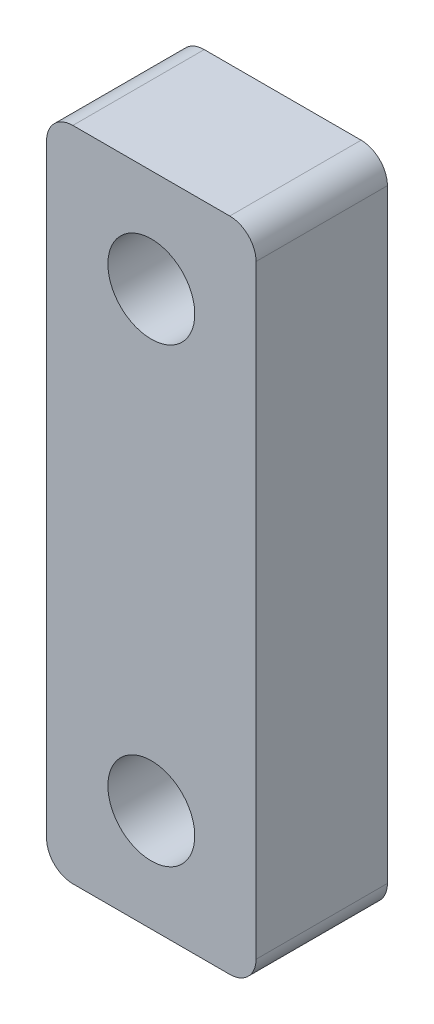
ISO-10303-21;
HEADER;
FILE_DESCRIPTION(('STEP AP214'),'2;1');
FILE_NAME('part.step','',(''),(''),'','','');
FILE_SCHEMA(('AUTOMOTIVE_DESIGN { 1 0 10303 214 1 1 1 1 }'));
ENDSEC;
DATA;
#1=APPLICATION_CONTEXT('core data for automotive mechanical design processes');
#2=APPLICATION_PROTOCOL_DEFINITION('international standard','automotive_design',2000,#1);
#3=PRODUCT_CONTEXT('',#1,'mechanical');
#4=PRODUCT('Part','Part','',(#3));
#5=PRODUCT_RELATED_PRODUCT_CATEGORY('part','',(#4));
#6=PRODUCT_DEFINITION_FORMATION('','',#4);
#7=PRODUCT_DEFINITION_CONTEXT('part definition',#1,'design');
#8=PRODUCT_DEFINITION('design','',#6,#7);
#9=PRODUCT_DEFINITION_SHAPE('','',#8);
#10=(LENGTH_UNIT() NAMED_UNIT(*) SI_UNIT(.MILLI.,.METRE.));
#11=(NAMED_UNIT(*) PLANE_ANGLE_UNIT() SI_UNIT($,.RADIAN.));
#12=(NAMED_UNIT(*) SI_UNIT($,.STERADIAN.) SOLID_ANGLE_UNIT());
#13=UNCERTAINTY_MEASURE_WITH_UNIT(LENGTH_MEASURE(1.E-05),#10,'distance_accuracy_value','');
#14=(GEOMETRIC_REPRESENTATION_CONTEXT(3) GLOBAL_UNCERTAINTY_ASSIGNED_CONTEXT((#13)) GLOBAL_UNIT_ASSIGNED_CONTEXT((#10,
#11,#12)) REPRESENTATION_CONTEXT('',''));
#15=CARTESIAN_POINT('',(0.,0.,0.));
#16=DIRECTION('',(0.,0.,1.));
#17=DIRECTION('',(1.,0.,0.));
#18=AXIS2_PLACEMENT_3D('',#15,#16,#17);
#19=CARTESIAN_POINT('',(468.012400016,1.31356913650478E-11,564.642));
#20=DIRECTION('',(1.,0.,0.));
#21=DIRECTION('',(0.,0.,-1.));
#22=AXIS2_PLACEMENT_3D('',#19,#20,#21);
#23=PLANE('',#22);
#24=DIRECTION('',(0.,1.,0.));
#25=VECTOR('',#24,1.);
#26=CARTESIAN_POINT('',(468.012400016,1.31356913650478E-11,564.642));
#27=LINE('',#26,#25);
#28=CARTESIAN_POINT('',(468.012400016,-14.6049999999869,564.642000000001));
#29=VERTEX_POINT('',#28);
#30=CARTESIAN_POINT('',(468.012400016,14.6050000000131,564.642));
#31=VERTEX_POINT('',#30);
#32=EDGE_CURVE('E129',#29,#31,#27,.T.);
#33=ORIENTED_EDGE('',*,*,#32,.F.);
#34=DIRECTION('',(0.,0.,1.));
#35=VECTOR('',#34,1.);
#36=CARTESIAN_POINT('',(468.012400016,-14.6049999999869,564.642));
#37=LINE('',#36,#35);
#38=CARTESIAN_POINT('',(468.012400016,-14.6049999999869,570.992000000001));
#39=VERTEX_POINT('',#38);
#40=EDGE_CURVE('E11',#29,#39,#37,.T.);
#41=ORIENTED_EDGE('',*,*,#40,.T.);
#42=DIRECTION('',(0.,1.,0.));
#43=VECTOR('',#42,1.);
#44=CARTESIAN_POINT('',(468.012400016,1.31356913650478E-11,570.992));
#45=LINE('',#44,#43);
#46=CARTESIAN_POINT('',(468.012400016,14.6050000000131,570.992));
#47=VERTEX_POINT('',#46);
#48=EDGE_CURVE('E131',#39,#47,#45,.T.);
#49=ORIENTED_EDGE('',*,*,#48,.T.);
#50=DIRECTION('',(0.,0.,1.));
#51=VECTOR('',#50,1.);
#52=CARTESIAN_POINT('',(468.012400016,14.6050000000131,564.642));
#53=LINE('',#52,#51);
#54=EDGE_CURVE('E42',#47,#31,#53,.F.);
#55=ORIENTED_EDGE('',*,*,#54,.T.);
#56=EDGE_LOOP('',(#33,#41,#49,#55));
#57=FACE_BOUND('',#56,.T.);
#58=ADVANCED_FACE('F34',(#57),#23,.F.);
#59=CARTESIAN_POINT('',(0.,15.8750000000131,564.642));
#60=DIRECTION('',(0.,-1.,0.));
#61=DIRECTION('',(0.,0.,-1.));
#62=AXIS2_PLACEMENT_3D('',#59,#60,#61);
#63=PLANE('',#62);
#64=DIRECTION('',(1.,0.,0.));
#65=VECTOR('',#64,1.);
#66=CARTESIAN_POINT('',(0.,15.8750000000131,570.992));
#67=LINE('',#66,#65);
#68=CARTESIAN_POINT('',(469.282400016,15.8750000000131,570.992));
#69=VERTEX_POINT('',#68);
#70=CARTESIAN_POINT('',(476.867599984,15.8750000000131,570.992));
#71=VERTEX_POINT('',#70);
#72=EDGE_CURVE('E127',#69,#71,#67,.T.);
#73=ORIENTED_EDGE('',*,*,#72,.T.);
#74=DIRECTION('',(0.,0.,1.));
#75=VECTOR('',#74,1.);
#76=CARTESIAN_POINT('',(476.867599984,15.8750000000131,564.642));
#77=LINE('',#76,#75);
#78=CARTESIAN_POINT('',(476.867599984,15.8750000000131,564.642));
#79=VERTEX_POINT('',#78);
#80=EDGE_CURVE('E106',#71,#79,#77,.F.);
#81=ORIENTED_EDGE('',*,*,#80,.T.);
#82=DIRECTION('',(1.,0.,0.));
#83=VECTOR('',#82,1.);
#84=CARTESIAN_POINT('',(0.,15.8750000000131,564.642));
#85=LINE('',#84,#83);
#86=CARTESIAN_POINT('',(469.282400016,15.8750000000131,564.642));
#87=VERTEX_POINT('',#86);
#88=EDGE_CURVE('E167',#87,#79,#85,.T.);
#89=ORIENTED_EDGE('',*,*,#88,.F.);
#90=DIRECTION('',(0.,0.,1.));
#91=VECTOR('',#90,1.);
#92=CARTESIAN_POINT('',(469.282400016,15.8750000000131,564.642));
#93=LINE('',#92,#91);
#94=EDGE_CURVE('E111',#87,#69,#93,.T.);
#95=ORIENTED_EDGE('',*,*,#94,.T.);
#96=EDGE_LOOP('',(#73,#81,#89,#95));
#97=FACE_BOUND('',#96,.T.);
#98=ADVANCED_FACE('F171',(#97),#63,.F.);
#99=CARTESIAN_POINT('',(478.137599984,1.31356913650478E-11,564.642));
#100=DIRECTION('',(-1.,0.,0.));
#101=DIRECTION('',(0.,0.,1.));
#102=AXIS2_PLACEMENT_3D('',#99,#100,#101);
#103=PLANE('',#102);
#104=DIRECTION('',(0.,-1.,0.));
#105=VECTOR('',#104,1.);
#106=CARTESIAN_POINT('',(478.137599984,1.31356913650478E-11,564.642));
#107=LINE('',#106,#105);
#108=CARTESIAN_POINT('',(478.137599984,14.6050000000131,564.642));
#109=VERTEX_POINT('',#108);
#110=CARTESIAN_POINT('',(478.137599984,-14.6049999999869,564.642000000001));
#111=VERTEX_POINT('',#110);
#112=EDGE_CURVE('E120',#109,#111,#107,.T.);
#113=ORIENTED_EDGE('',*,*,#112,.F.);
#114=DIRECTION('',(0.,0.,1.));
#115=VECTOR('',#114,1.);
#116=CARTESIAN_POINT('',(478.137599984,14.6050000000131,564.642));
#117=LINE('',#116,#115);
#118=CARTESIAN_POINT('',(478.137599984,14.6050000000131,570.992));
#119=VERTEX_POINT('',#118);
#120=EDGE_CURVE('E105',#109,#119,#117,.T.);
#121=ORIENTED_EDGE('',*,*,#120,.T.);
#122=DIRECTION('',(0.,-1.,0.));
#123=VECTOR('',#122,1.);
#124=CARTESIAN_POINT('',(478.137599984,1.31356913650478E-11,570.992));
#125=LINE('',#124,#123);
#126=CARTESIAN_POINT('',(478.137599984,-14.6049999999869,570.992000000001));
#127=VERTEX_POINT('',#126);
#128=EDGE_CURVE('E118',#119,#127,#125,.T.);
#129=ORIENTED_EDGE('',*,*,#128,.T.);
#130=DIRECTION('',(0.,0.,1.));
#131=VECTOR('',#130,1.);
#132=CARTESIAN_POINT('',(478.137599984,-14.6049999999869,564.642));
#133=LINE('',#132,#131);
#134=EDGE_CURVE('E122',#127,#111,#133,.F.);
#135=ORIENTED_EDGE('',*,*,#134,.T.);
#136=EDGE_LOOP('',(#113,#121,#129,#135));
#137=FACE_BOUND('',#136,.T.);
#138=ADVANCED_FACE('F117',(#137),#103,.F.);
#139=CARTESIAN_POINT('',(0.,-15.8749999999869,564.642000000001));
#140=DIRECTION('',(0.,1.,0.));
#141=DIRECTION('',(0.,0.,1.));
#142=AXIS2_PLACEMENT_3D('',#139,#140,#141);
#143=PLANE('',#142);
#144=DIRECTION('',(-1.,0.,0.));
#145=VECTOR('',#144,1.);
#146=CARTESIAN_POINT('',(0.,-15.8749999999869,564.642000000001));
#147=LINE('',#146,#145);
#148=CARTESIAN_POINT('',(476.867599984,-15.8749999999869,564.642000000001));
#149=VERTEX_POINT('',#148);
#150=CARTESIAN_POINT('',(469.282400016,-15.8749999999869,564.642000000001));
#151=VERTEX_POINT('',#150);
#152=EDGE_CURVE('E135',#149,#151,#147,.T.);
#153=ORIENTED_EDGE('',*,*,#152,.F.);
#154=DIRECTION('',(0.,0.,1.));
#155=VECTOR('',#154,1.);
#156=CARTESIAN_POINT('',(476.867599984,-15.8749999999869,564.642000000001));
#157=LINE('',#156,#155);
#158=CARTESIAN_POINT('',(476.867599984,-15.8749999999869,570.992000000001));
#159=VERTEX_POINT('',#158);
#160=EDGE_CURVE('E152',#149,#159,#157,.T.);
#161=ORIENTED_EDGE('',*,*,#160,.T.);
#162=DIRECTION('',(-1.,0.,0.));
#163=VECTOR('',#162,1.);
#164=CARTESIAN_POINT('',(0.,-15.8749999999869,570.992000000001));
#165=LINE('',#164,#163);
#166=CARTESIAN_POINT('',(469.282400016,-15.8749999999869,570.992000000001));
#167=VERTEX_POINT('',#166);
#168=EDGE_CURVE('E126',#159,#167,#165,.T.);
#169=ORIENTED_EDGE('',*,*,#168,.T.);
#170=DIRECTION('',(0.,0.,1.));
#171=VECTOR('',#170,1.);
#172=CARTESIAN_POINT('',(469.282400016,-15.8749999999869,564.642000000001));
#173=LINE('',#172,#171);
#174=EDGE_CURVE('E49',#167,#151,#173,.F.);
#175=ORIENTED_EDGE('',*,*,#174,.T.);
#176=EDGE_LOOP('',(#153,#161,#169,#175));
#177=FACE_BOUND('',#176,.T.);
#178=ADVANCED_FACE('F275',(#177),#143,.F.);
#179=CARTESIAN_POINT('',(0.,1.31356913650477E-11,564.642));
#180=DIRECTION('',(0.,0.,-1.));
#181=DIRECTION('',(0.,1.,0.));
#182=AXIS2_PLACEMENT_3D('',#179,#180,#181);
#183=PLANE('',#182);
#184=CARTESIAN_POINT('',(473.075,10.9220000000131,564.642));
#185=DIRECTION('',(0.,0.,1.));
#186=DIRECTION('',(0.,-1.,0.));
#187=AXIS2_PLACEMENT_3D('',#184,#185,#186);
#188=CIRCLE('',#187,2.09999999999999);
#189=CARTESIAN_POINT('',(473.075,8.82200000001315,564.642));
#190=VERTEX_POINT('',#189);
#191=EDGE_CURVE('E181',#190,#190,#188,.T.);
#192=ORIENTED_EDGE('',*,*,#191,.T.);
#193=EDGE_LOOP('',(#192));
#194=FACE_BOUND('',#193,.T.);
#195=CARTESIAN_POINT('',(473.075,-10.9219999999869,564.642000000001));
#196=DIRECTION('',(0.,0.,1.));
#197=DIRECTION('',(0.,-1.,0.));
#198=AXIS2_PLACEMENT_3D('',#195,#196,#197);
#199=CIRCLE('',#198,2.09999999999999);
#200=CARTESIAN_POINT('',(473.075,-13.0219999999869,564.642000000001));
#201=VERTEX_POINT('',#200);
#202=EDGE_CURVE('E172',#201,#201,#199,.T.);
#203=ORIENTED_EDGE('',*,*,#202,.T.);
#204=EDGE_LOOP('',(#203));
#205=FACE_BOUND('',#204,.T.);
#206=ORIENTED_EDGE('',*,*,#88,.T.);
#207=CARTESIAN_POINT('',(476.867599984,14.6050000000131,564.642));
#208=DIRECTION('',(0.,0.,-1.));
#209=DIRECTION('',(0.,1.,0.));
#210=AXIS2_PLACEMENT_3D('',#207,#208,#209);
#211=CIRCLE('',#210,1.27);
#212=EDGE_CURVE('E149',#79,#109,#211,.T.);
#213=ORIENTED_EDGE('',*,*,#212,.T.);
#214=ORIENTED_EDGE('',*,*,#112,.T.);
#215=CARTESIAN_POINT('',(476.867599984,-14.6049999999869,564.642000000001));
#216=DIRECTION('',(0.,0.,-1.));
#217=DIRECTION('',(0.,1.,0.));
#218=AXIS2_PLACEMENT_3D('',#215,#216,#217);
#219=CIRCLE('',#218,1.27);
#220=EDGE_CURVE('E56',#111,#149,#219,.T.);
#221=ORIENTED_EDGE('',*,*,#220,.T.);
#222=ORIENTED_EDGE('',*,*,#152,.T.);
#223=CARTESIAN_POINT('',(469.282400016,-14.6049999999869,564.642000000001));
#224=DIRECTION('',(0.,0.,-1.));
#225=DIRECTION('',(0.,1.,0.));
#226=AXIS2_PLACEMENT_3D('',#223,#224,#225);
#227=CIRCLE('',#226,1.27);
#228=EDGE_CURVE('E146',#151,#29,#227,.T.);
#229=ORIENTED_EDGE('',*,*,#228,.T.);
#230=ORIENTED_EDGE('',*,*,#32,.T.);
#231=CARTESIAN_POINT('',(469.282400016,14.6050000000131,564.642));
#232=DIRECTION('',(0.,0.,-1.));
#233=DIRECTION('',(0.,1.,0.));
#234=AXIS2_PLACEMENT_3D('',#231,#232,#233);
#235=CIRCLE('',#234,1.27);
#236=EDGE_CURVE('E144',#31,#87,#235,.T.);
#237=ORIENTED_EDGE('',*,*,#236,.T.);
#238=EDGE_LOOP('',(#206,#213,#214,#221,#222,#229,#230,#237));
#239=FACE_BOUND('',#238,.T.);
#240=ADVANCED_FACE('F164',(#194,#205,#239),#183,.T.);
#241=CARTESIAN_POINT('',(0.,1.31356913650477E-11,570.992));
#242=DIRECTION('',(0.,0.,-1.));
#243=DIRECTION('',(0.,1.,0.));
#244=AXIS2_PLACEMENT_3D('',#241,#242,#243);
#245=PLANE('',#244);
#246=CARTESIAN_POINT('',(473.075,10.9220000000131,570.992));
#247=DIRECTION('',(0.,0.,1.));
#248=DIRECTION('',(0.,-1.,0.));
#249=AXIS2_PLACEMENT_3D('',#246,#247,#248);
#250=CIRCLE('',#249,2.09999999999999);
#251=CARTESIAN_POINT('',(473.075,8.82200000001315,570.992));
#252=VERTEX_POINT('',#251);
#253=EDGE_CURVE('E183',#252,#252,#250,.T.);
#254=ORIENTED_EDGE('',*,*,#253,.F.);
#255=EDGE_LOOP('',(#254));
#256=FACE_BOUND('',#255,.T.);
#257=CARTESIAN_POINT('',(473.075,-10.9219999999869,570.992000000001));
#258=DIRECTION('',(0.,0.,1.));
#259=DIRECTION('',(0.,-1.,0.));
#260=AXIS2_PLACEMENT_3D('',#257,#258,#259);
#261=CIRCLE('',#260,2.09999999999999);
#262=CARTESIAN_POINT('',(473.075,-13.0219999999869,570.992000000001));
#263=VERTEX_POINT('',#262);
#264=EDGE_CURVE('E174',#263,#263,#261,.T.);
#265=ORIENTED_EDGE('',*,*,#264,.F.);
#266=EDGE_LOOP('',(#265));
#267=FACE_BOUND('',#266,.T.);
#268=ORIENTED_EDGE('',*,*,#128,.F.);
#269=CARTESIAN_POINT('',(476.867599984,14.6050000000131,570.992));
#270=DIRECTION('',(0.,0.,-1.));
#271=DIRECTION('',(0.,1.,0.));
#272=AXIS2_PLACEMENT_3D('',#269,#270,#271);
#273=CIRCLE('',#272,1.27);
#274=EDGE_CURVE('E101',#119,#71,#273,.F.);
#275=ORIENTED_EDGE('',*,*,#274,.T.);
#276=ORIENTED_EDGE('',*,*,#72,.F.);
#277=CARTESIAN_POINT('',(469.282400016,14.6050000000131,570.992));
#278=DIRECTION('',(0.,0.,-1.));
#279=DIRECTION('',(0.,1.,0.));
#280=AXIS2_PLACEMENT_3D('',#277,#278,#279);
#281=CIRCLE('',#280,1.27);
#282=EDGE_CURVE('E121',#69,#47,#281,.F.);
#283=ORIENTED_EDGE('',*,*,#282,.T.);
#284=ORIENTED_EDGE('',*,*,#48,.F.);
#285=CARTESIAN_POINT('',(469.282400016,-14.6049999999869,570.992000000001));
#286=DIRECTION('',(0.,0.,-1.));
#287=DIRECTION('',(0.,1.,0.));
#288=AXIS2_PLACEMENT_3D('',#285,#286,#287);
#289=CIRCLE('',#288,1.27);
#290=EDGE_CURVE('E138',#39,#167,#289,.F.);
#291=ORIENTED_EDGE('',*,*,#290,.T.);
#292=ORIENTED_EDGE('',*,*,#168,.F.);
#293=CARTESIAN_POINT('',(476.867599984,-14.6049999999869,570.992000000001));
#294=DIRECTION('',(0.,0.,-1.));
#295=DIRECTION('',(0.,1.,0.));
#296=AXIS2_PLACEMENT_3D('',#293,#294,#295);
#297=CIRCLE('',#296,1.27);
#298=EDGE_CURVE('E112',#159,#127,#297,.F.);
#299=ORIENTED_EDGE('',*,*,#298,.T.);
#300=EDGE_LOOP('',(#268,#275,#276,#283,#284,#291,#292,#299));
#301=FACE_BOUND('',#300,.T.);
#302=ADVANCED_FACE('F124',(#256,#267,#301),#245,.F.);
#303=CARTESIAN_POINT('',(473.075,-10.9219999999869,564.642000000001));
#304=DIRECTION('',(0.,0.,1.));
#305=DIRECTION('',(1.,0.,0.));
#306=AXIS2_PLACEMENT_3D('',#303,#304,#305);
#307=CYLINDRICAL_SURFACE('',#306,2.09999999999999);
#308=ORIENTED_EDGE('',*,*,#202,.F.);
#309=EDGE_LOOP('',(#308));
#310=FACE_BOUND('',#309,.T.);
#311=ORIENTED_EDGE('',*,*,#264,.T.);
#312=EDGE_LOOP('',(#311));
#313=FACE_BOUND('',#312,.T.);
#314=ADVANCED_FACE('F194',(#310,#313),#307,.F.);
#315=CARTESIAN_POINT('',(473.075,10.9220000000131,564.642));
#316=DIRECTION('',(0.,0.,1.));
#317=DIRECTION('',(1.,0.,0.));
#318=AXIS2_PLACEMENT_3D('',#315,#316,#317);
#319=CYLINDRICAL_SURFACE('',#318,2.09999999999999);
#320=ORIENTED_EDGE('',*,*,#191,.F.);
#321=EDGE_LOOP('',(#320));
#322=FACE_BOUND('',#321,.T.);
#323=ORIENTED_EDGE('',*,*,#253,.T.);
#324=EDGE_LOOP('',(#323));
#325=FACE_BOUND('',#324,.T.);
#326=ADVANCED_FACE('F191',(#322,#325),#319,.F.);
#327=CARTESIAN_POINT('',(476.867599984,14.6050000000131,564.642));
#328=DIRECTION('',(0.,0.,1.));
#329=DIRECTION('',(1.,0.,0.));
#330=AXIS2_PLACEMENT_3D('',#327,#328,#329);
#331=CYLINDRICAL_SURFACE('',#330,1.27);
#332=ORIENTED_EDGE('',*,*,#212,.F.);
#333=ORIENTED_EDGE('',*,*,#80,.F.);
#334=ORIENTED_EDGE('',*,*,#274,.F.);
#335=ORIENTED_EDGE('',*,*,#120,.F.);
#336=EDGE_LOOP('',(#332,#333,#334,#335));
#337=FACE_BOUND('',#336,.T.);
#338=ADVANCED_FACE('F104',(#337),#331,.T.);
#339=CARTESIAN_POINT('',(476.867599984,-14.6049999999869,564.642000000001));
#340=DIRECTION('',(0.,0.,1.));
#341=DIRECTION('',(1.,0.,0.));
#342=AXIS2_PLACEMENT_3D('',#339,#340,#341);
#343=CYLINDRICAL_SURFACE('',#342,1.27);
#344=ORIENTED_EDGE('',*,*,#220,.F.);
#345=ORIENTED_EDGE('',*,*,#134,.F.);
#346=ORIENTED_EDGE('',*,*,#298,.F.);
#347=ORIENTED_EDGE('',*,*,#160,.F.);
#348=EDGE_LOOP('',(#344,#345,#346,#347));
#349=FACE_BOUND('',#348,.T.);
#350=ADVANCED_FACE('F220',(#349),#343,.T.);
#351=CARTESIAN_POINT('',(469.282400016,-14.6049999999869,564.642));
#352=DIRECTION('',(0.,0.,1.));
#353=DIRECTION('',(1.,0.,0.));
#354=AXIS2_PLACEMENT_3D('',#351,#352,#353);
#355=CYLINDRICAL_SURFACE('',#354,1.27);
#356=ORIENTED_EDGE('',*,*,#228,.F.);
#357=ORIENTED_EDGE('',*,*,#174,.F.);
#358=ORIENTED_EDGE('',*,*,#290,.F.);
#359=ORIENTED_EDGE('',*,*,#40,.F.);
#360=EDGE_LOOP('',(#356,#357,#358,#359));
#361=FACE_BOUND('',#360,.T.);
#362=ADVANCED_FACE('F222',(#361),#355,.T.);
#363=CARTESIAN_POINT('',(469.282400016,14.6050000000131,564.642));
#364=DIRECTION('',(0.,0.,1.));
#365=DIRECTION('',(1.,0.,0.));
#366=AXIS2_PLACEMENT_3D('',#363,#364,#365);
#367=CYLINDRICAL_SURFACE('',#366,1.27);
#368=ORIENTED_EDGE('',*,*,#236,.F.);
#369=ORIENTED_EDGE('',*,*,#54,.F.);
#370=ORIENTED_EDGE('',*,*,#282,.F.);
#371=ORIENTED_EDGE('',*,*,#94,.F.);
#372=EDGE_LOOP('',(#368,#369,#370,#371));
#373=FACE_BOUND('',#372,.T.);
#374=ADVANCED_FACE('F36',(#373),#367,.T.);
#375=CLOSED_SHELL('',(#58,#98,#138,#178,#240,#302,#314,#326,#338,#350,#362,#374));
#376=MANIFOLD_SOLID_BREP('B2',#375);
#377=ADVANCED_BREP_SHAPE_REPRESENTATION('',(#18,#376),#14);
#378=SHAPE_DEFINITION_REPRESENTATION(#9,#377);
ENDSEC;
END-ISO-10303-21;
